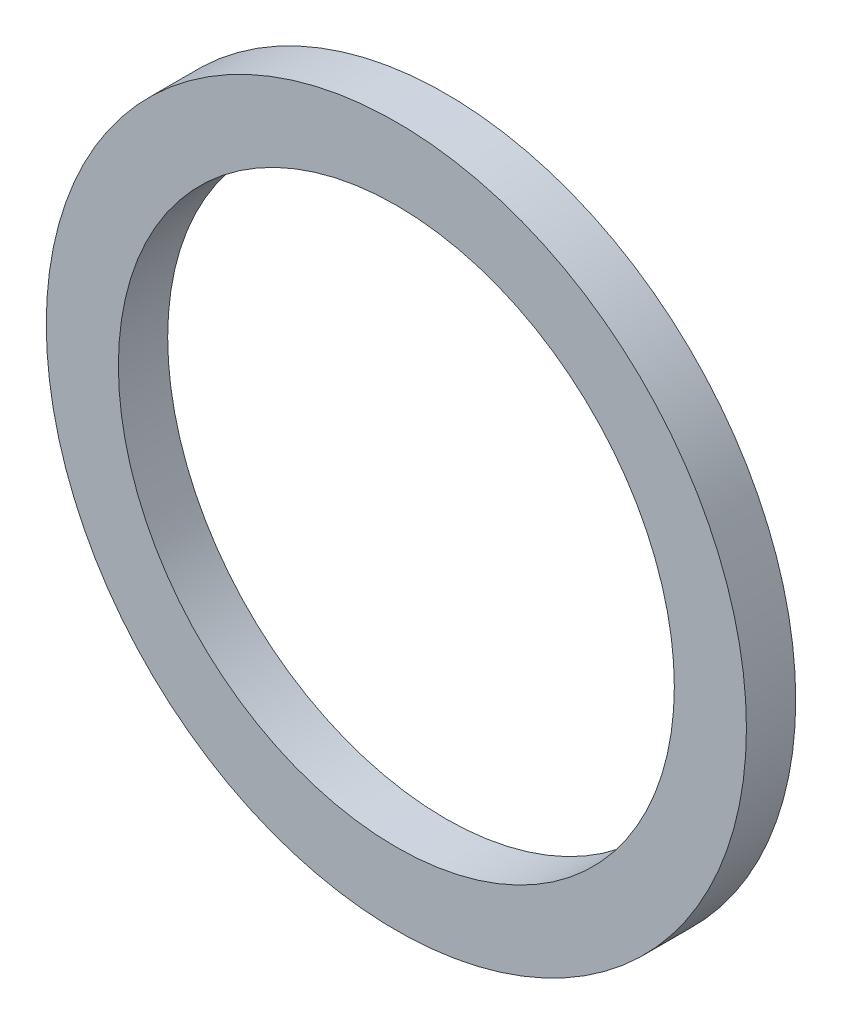
ISO-10303-21;
HEADER;
FILE_DESCRIPTION(('STEP AP214'),'2;1');
FILE_NAME('part.step','',(''),(''),'','','');
FILE_SCHEMA(('AUTOMOTIVE_DESIGN { 1 0 10303 214 1 1 1 1 }'));
ENDSEC;
DATA;
#1=APPLICATION_CONTEXT('core data for automotive mechanical design processes');
#2=APPLICATION_PROTOCOL_DEFINITION('international standard','automotive_design',2000,#1);
#3=PRODUCT_CONTEXT('',#1,'mechanical');
#4=PRODUCT('Part','Part','',(#3));
#5=PRODUCT_RELATED_PRODUCT_CATEGORY('part','',(#4));
#6=PRODUCT_DEFINITION_FORMATION('','',#4);
#7=PRODUCT_DEFINITION_CONTEXT('part definition',#1,'design');
#8=PRODUCT_DEFINITION('design','',#6,#7);
#9=PRODUCT_DEFINITION_SHAPE('','',#8);
#10=(LENGTH_UNIT() NAMED_UNIT(*) SI_UNIT(.MILLI.,.METRE.));
#11=(NAMED_UNIT(*) PLANE_ANGLE_UNIT() SI_UNIT($,.RADIAN.));
#12=(NAMED_UNIT(*) SI_UNIT($,.STERADIAN.) SOLID_ANGLE_UNIT());
#13=UNCERTAINTY_MEASURE_WITH_UNIT(LENGTH_MEASURE(1.E-05),#10,'distance_accuracy_value','');
#14=(GEOMETRIC_REPRESENTATION_CONTEXT(3) GLOBAL_UNCERTAINTY_ASSIGNED_CONTEXT((#13)) GLOBAL_UNIT_ASSIGNED_CONTEXT((#10,
#11,#12)) REPRESENTATION_CONTEXT('',''));
#15=CARTESIAN_POINT('',(0.,0.,0.));
#16=DIRECTION('',(0.,0.,1.));
#17=DIRECTION('',(1.,0.,0.));
#18=AXIS2_PLACEMENT_3D('',#15,#16,#17);
#19=CARTESIAN_POINT('',(0.,0.,3.175));
#20=DIRECTION('',(0.,0.,1.));
#21=DIRECTION('',(1.,0.,0.));
#22=AXIS2_PLACEMENT_3D('',#19,#20,#21);
#23=PLANE('',#22);
#24=CARTESIAN_POINT('',(0.,0.,3.175));
#25=DIRECTION('',(0.,0.,1.));
#26=DIRECTION('',(1.,0.,0.));
#27=AXIS2_PLACEMENT_3D('',#24,#25,#26);
#28=CIRCLE('',#27,22.5425);
#29=CARTESIAN_POINT('',(22.5425,0.,3.175));
#30=VERTEX_POINT('',#29);
#31=EDGE_CURVE('E10',#30,#30,#28,.T.);
#32=ORIENTED_EDGE('',*,*,#31,.T.);
#33=EDGE_LOOP('',(#32));
#34=FACE_BOUND('',#33,.T.);
#35=CARTESIAN_POINT('',(0.,0.,3.175));
#36=DIRECTION('',(0.,0.,1.));
#37=DIRECTION('',(1.,0.,0.));
#38=AXIS2_PLACEMENT_3D('',#35,#36,#37);
#39=CIRCLE('',#38,17.9);
#40=CARTESIAN_POINT('',(17.9,0.,3.175));
#41=VERTEX_POINT('',#40);
#42=EDGE_CURVE('E50',#41,#41,#39,.T.);
#43=ORIENTED_EDGE('',*,*,#42,.F.);
#44=EDGE_LOOP('',(#43));
#45=FACE_BOUND('',#44,.T.);
#46=ADVANCED_FACE('F36',(#34,#45),#23,.T.);
#47=CARTESIAN_POINT('',(0.,0.,0.));
#48=DIRECTION('',(0.,0.,1.));
#49=DIRECTION('',(1.,0.,0.));
#50=AXIS2_PLACEMENT_3D('',#47,#48,#49);
#51=PLANE('',#50);
#52=CARTESIAN_POINT('',(0.,0.,0.));
#53=DIRECTION('',(0.,0.,1.));
#54=DIRECTION('',(1.,0.,0.));
#55=AXIS2_PLACEMENT_3D('',#52,#53,#54);
#56=CIRCLE('',#55,22.5425);
#57=CARTESIAN_POINT('',(22.5425,0.,0.));
#58=VERTEX_POINT('',#57);
#59=EDGE_CURVE('E40',#58,#58,#56,.T.);
#60=ORIENTED_EDGE('',*,*,#59,.F.);
#61=EDGE_LOOP('',(#60));
#62=FACE_BOUND('',#61,.T.);
#63=CARTESIAN_POINT('',(0.,0.,0.));
#64=DIRECTION('',(0.,0.,1.));
#65=DIRECTION('',(1.,0.,0.));
#66=AXIS2_PLACEMENT_3D('',#63,#64,#65);
#67=CIRCLE('',#66,17.9);
#68=CARTESIAN_POINT('',(17.9,0.,0.));
#69=VERTEX_POINT('',#68);
#70=EDGE_CURVE('E52',#69,#69,#67,.T.);
#71=ORIENTED_EDGE('',*,*,#70,.T.);
#72=EDGE_LOOP('',(#71));
#73=FACE_BOUND('',#72,.T.);
#74=ADVANCED_FACE('F65',(#62,#73),#51,.F.);
#75=CARTESIAN_POINT('',(0.,0.,3.175));
#76=DIRECTION('',(0.,0.,-1.));
#77=DIRECTION('',(-1.,0.,0.));
#78=AXIS2_PLACEMENT_3D('',#75,#76,#77);
#79=CYLINDRICAL_SURFACE('',#78,22.5425);
#80=ORIENTED_EDGE('',*,*,#31,.F.);
#81=EDGE_LOOP('',(#80));
#82=FACE_BOUND('',#81,.T.);
#83=ORIENTED_EDGE('',*,*,#59,.T.);
#84=EDGE_LOOP('',(#83));
#85=FACE_BOUND('',#84,.T.);
#86=ADVANCED_FACE('F38',(#82,#85),#79,.T.);
#87=CARTESIAN_POINT('',(0.,0.,3.175));
#88=DIRECTION('',(0.,0.,-1.));
#89=DIRECTION('',(-1.,0.,0.));
#90=AXIS2_PLACEMENT_3D('',#87,#88,#89);
#91=CYLINDRICAL_SURFACE('',#90,17.9);
#92=ORIENTED_EDGE('',*,*,#42,.T.);
#93=EDGE_LOOP('',(#92));
#94=FACE_BOUND('',#93,.T.);
#95=ORIENTED_EDGE('',*,*,#70,.F.);
#96=EDGE_LOOP('',(#95));
#97=FACE_BOUND('',#96,.T.);
#98=ADVANCED_FACE('F61',(#94,#97),#91,.F.);
#99=CLOSED_SHELL('',(#46,#74,#86,#98));
#100=MANIFOLD_SOLID_BREP('B2',#99);
#101=ADVANCED_BREP_SHAPE_REPRESENTATION('',(#18,#100),#14);
#102=SHAPE_DEFINITION_REPRESENTATION(#9,#101);
ENDSEC;
END-ISO-10303-21;
